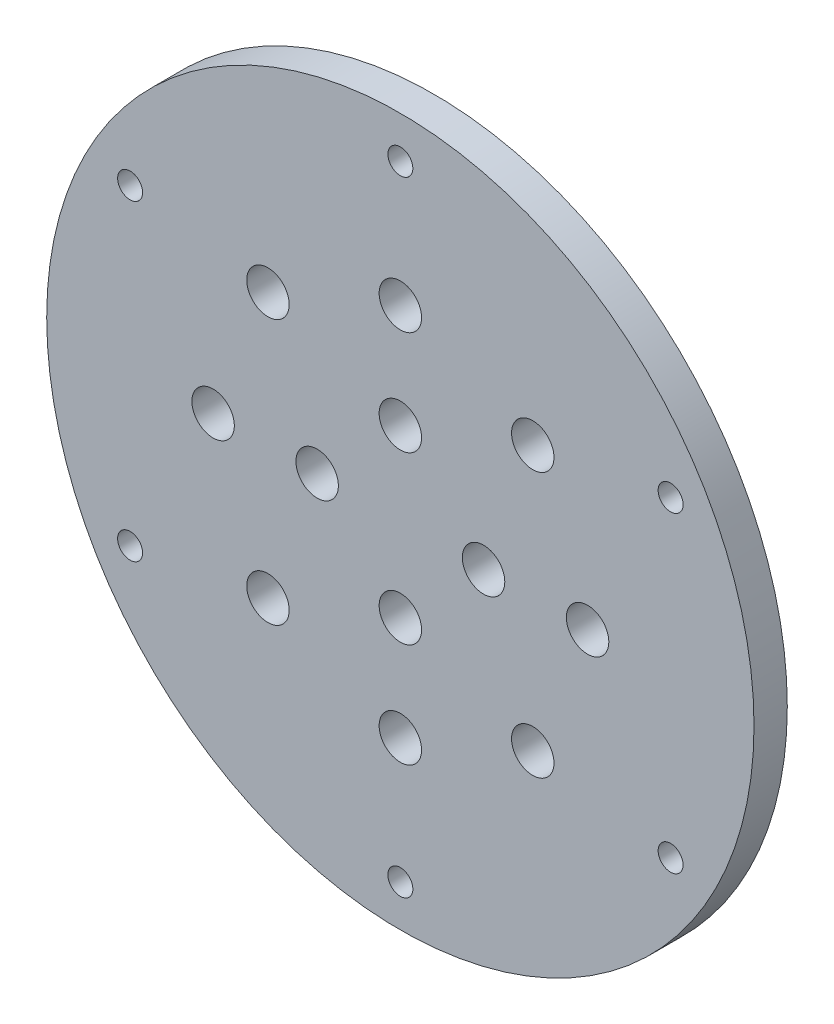
ISO-10303-21;
HEADER;
FILE_DESCRIPTION(('STEP AP214'),'2;1');
FILE_NAME('part.step','',(''),(''),'','','');
FILE_SCHEMA(('AUTOMOTIVE_DESIGN { 1 0 10303 214 1 1 1 1 }'));
ENDSEC;
DATA;
#1=APPLICATION_CONTEXT('core data for automotive mechanical design processes');
#2=APPLICATION_PROTOCOL_DEFINITION('international standard','automotive_design',2000,#1);
#3=PRODUCT_CONTEXT('',#1,'mechanical');
#4=PRODUCT('Part','Part','',(#3));
#5=PRODUCT_RELATED_PRODUCT_CATEGORY('part','',(#4));
#6=PRODUCT_DEFINITION_FORMATION('','',#4);
#7=PRODUCT_DEFINITION_CONTEXT('part definition',#1,'design');
#8=PRODUCT_DEFINITION('design','',#6,#7);
#9=PRODUCT_DEFINITION_SHAPE('','',#8);
#10=(LENGTH_UNIT() NAMED_UNIT(*) SI_UNIT(.MILLI.,.METRE.));
#11=(NAMED_UNIT(*) PLANE_ANGLE_UNIT() SI_UNIT($,.RADIAN.));
#12=(NAMED_UNIT(*) SI_UNIT($,.STERADIAN.) SOLID_ANGLE_UNIT());
#13=UNCERTAINTY_MEASURE_WITH_UNIT(LENGTH_MEASURE(1.E-05),#10,'distance_accuracy_value','');
#14=(GEOMETRIC_REPRESENTATION_CONTEXT(3) GLOBAL_UNCERTAINTY_ASSIGNED_CONTEXT((#13)) GLOBAL_UNIT_ASSIGNED_CONTEXT((#10,
#11,#12)) REPRESENTATION_CONTEXT('',''));
#15=CARTESIAN_POINT('',(0.,0.,0.));
#16=DIRECTION('',(0.,0.,1.));
#17=DIRECTION('',(1.,0.,0.));
#18=AXIS2_PLACEMENT_3D('',#15,#16,#17);
#19=CARTESIAN_POINT('',(0.,0.,8.));
#20=DIRECTION('',(0.,0.,1.));
#21=DIRECTION('',(1.,0.,0.));
#22=AXIS2_PLACEMENT_3D('',#19,#20,#21);
#23=PLANE('',#22);
#24=CARTESIAN_POINT('',(0.,45.,8.));
#25=DIRECTION('',(0.,0.,1.));
#26=DIRECTION('',(1.,0.,0.));
#27=AXIS2_PLACEMENT_3D('',#24,#25,#26);
#28=CIRCLE('',#27,5.1);
#29=CARTESIAN_POINT('',(5.1,45.,8.));
#30=VERTEX_POINT('',#29);
#31=EDGE_CURVE('E115',#30,#30,#28,.T.);
#32=ORIENTED_EDGE('',*,*,#31,.F.);
#33=EDGE_LOOP('',(#32));
#34=FACE_BOUND('',#33,.T.);
#35=CARTESIAN_POINT('',(-20.,2.09488880330588E-13,8.));
#36=DIRECTION('',(0.,0.,1.));
#37=DIRECTION('',(1.,0.,0.));
#38=AXIS2_PLACEMENT_3D('',#35,#36,#37);
#39=CIRCLE('',#38,5.1);
#40=CARTESIAN_POINT('',(-14.9,2.09488880330588E-13,8.));
#41=VERTEX_POINT('',#40);
#42=EDGE_CURVE('E140',#41,#41,#39,.T.);
#43=ORIENTED_EDGE('',*,*,#42,.F.);
#44=EDGE_LOOP('',(#43));
#45=FACE_BOUND('',#44,.T.);
#46=CARTESIAN_POINT('',(-1.39659253553725E-13,-20.,8.));
#47=DIRECTION('',(0.,0.,1.));
#48=DIRECTION('',(1.,0.,0.));
#49=AXIS2_PLACEMENT_3D('',#46,#47,#48);
#50=CIRCLE('',#49,5.1);
#51=CARTESIAN_POINT('',(5.09999999999986,-20.,8.));
#52=VERTEX_POINT('',#51);
#53=EDGE_CURVE('E146',#52,#52,#50,.T.);
#54=ORIENTED_EDGE('',*,*,#53,.F.);
#55=EDGE_LOOP('',(#54));
#56=FACE_BOUND('',#55,.T.);
#57=CARTESIAN_POINT('',(20.,0.,8.));
#58=DIRECTION('',(0.,0.,1.));
#59=DIRECTION('',(1.,0.,0.));
#60=AXIS2_PLACEMENT_3D('',#57,#58,#59);
#61=CIRCLE('',#60,5.1);
#62=CARTESIAN_POINT('',(25.1,0.,8.));
#63=VERTEX_POINT('',#62);
#64=EDGE_CURVE('E152',#63,#63,#61,.T.);
#65=ORIENTED_EDGE('',*,*,#64,.F.);
#66=EDGE_LOOP('',(#65));
#67=FACE_BOUND('',#66,.T.);
#68=CARTESIAN_POINT('',(31.8198051533946,31.8198051533946,8.));
#69=DIRECTION('',(0.,0.,1.));
#70=DIRECTION('',(1.,0.,0.));
#71=AXIS2_PLACEMENT_3D('',#68,#69,#70);
#72=CIRCLE('',#71,5.1);
#73=CARTESIAN_POINT('',(36.9198051533946,31.8198051533946,8.));
#74=VERTEX_POINT('',#73);
#75=EDGE_CURVE('E109',#74,#74,#72,.T.);
#76=ORIENTED_EDGE('',*,*,#75,.F.);
#77=EDGE_LOOP('',(#76));
#78=FACE_BOUND('',#77,.T.);
#79=CARTESIAN_POINT('',(45.,0.,8.));
#80=DIRECTION('',(0.,0.,1.));
#81=DIRECTION('',(1.,0.,0.));
#82=AXIS2_PLACEMENT_3D('',#79,#80,#81);
#83=CIRCLE('',#82,5.1);
#84=CARTESIAN_POINT('',(50.1,0.,8.));
#85=VERTEX_POINT('',#84);
#86=EDGE_CURVE('E103',#85,#85,#83,.T.);
#87=ORIENTED_EDGE('',*,*,#86,.F.);
#88=EDGE_LOOP('',(#87));
#89=FACE_BOUND('',#88,.T.);
#90=CARTESIAN_POINT('',(31.8198051533946,-31.8198051533946,8.));
#91=DIRECTION('',(0.,0.,1.));
#92=DIRECTION('',(1.,0.,0.));
#93=AXIS2_PLACEMENT_3D('',#90,#91,#92);
#94=CIRCLE('',#93,5.1);
#95=CARTESIAN_POINT('',(36.9198051533946,-31.8198051533946,8.));
#96=VERTEX_POINT('',#95);
#97=EDGE_CURVE('E97',#96,#96,#94,.T.);
#98=ORIENTED_EDGE('',*,*,#97,.F.);
#99=EDGE_LOOP('',(#98));
#100=FACE_BOUND('',#99,.T.);
#101=CARTESIAN_POINT('',(0.,-45.,8.));
#102=DIRECTION('',(0.,0.,1.));
#103=DIRECTION('',(1.,0.,0.));
#104=AXIS2_PLACEMENT_3D('',#101,#102,#103);
#105=CIRCLE('',#104,5.1);
#106=CARTESIAN_POINT('',(5.1,-45.,8.));
#107=VERTEX_POINT('',#106);
#108=EDGE_CURVE('E90',#107,#107,#105,.T.);
#109=ORIENTED_EDGE('',*,*,#108,.F.);
#110=EDGE_LOOP('',(#109));
#111=FACE_BOUND('',#110,.T.);
#112=CARTESIAN_POINT('',(-31.8198051533946,-31.8198051533946,8.));
#113=DIRECTION('',(0.,0.,1.));
#114=DIRECTION('',(1.,0.,0.));
#115=AXIS2_PLACEMENT_3D('',#112,#113,#114);
#116=CIRCLE('',#115,5.1);
#117=CARTESIAN_POINT('',(-26.7198051533946,-31.8198051533946,8.));
#118=VERTEX_POINT('',#117);
#119=EDGE_CURVE('E135',#118,#118,#116,.T.);
#120=ORIENTED_EDGE('',*,*,#119,.F.);
#121=EDGE_LOOP('',(#120));
#122=FACE_BOUND('',#121,.T.);
#123=CARTESIAN_POINT('',(-45.,0.,8.));
#124=DIRECTION('',(0.,0.,1.));
#125=DIRECTION('',(1.,0.,0.));
#126=AXIS2_PLACEMENT_3D('',#123,#124,#125);
#127=CIRCLE('',#126,5.1);
#128=CARTESIAN_POINT('',(-39.9,0.,8.));
#129=VERTEX_POINT('',#128);
#130=EDGE_CURVE('E129',#129,#129,#127,.T.);
#131=ORIENTED_EDGE('',*,*,#130,.F.);
#132=EDGE_LOOP('',(#131));
#133=FACE_BOUND('',#132,.T.);
#134=CARTESIAN_POINT('',(-31.8198051533946,31.8198051533946,8.));
#135=DIRECTION('',(0.,0.,1.));
#136=DIRECTION('',(1.,0.,0.));
#137=AXIS2_PLACEMENT_3D('',#134,#135,#136);
#138=CIRCLE('',#137,5.1);
#139=CARTESIAN_POINT('',(-26.7198051533946,31.8198051533946,8.));
#140=VERTEX_POINT('',#139);
#141=EDGE_CURVE('E123',#140,#140,#138,.T.);
#142=ORIENTED_EDGE('',*,*,#141,.F.);
#143=EDGE_LOOP('',(#142));
#144=FACE_BOUND('',#143,.T.);
#145=CARTESIAN_POINT('',(0.,20.,8.));
#146=DIRECTION('',(0.,0.,1.));
#147=DIRECTION('',(1.,0.,0.));
#148=AXIS2_PLACEMENT_3D('',#145,#146,#147);
#149=CIRCLE('',#148,5.1);
#150=CARTESIAN_POINT('',(5.1,20.,8.));
#151=VERTEX_POINT('',#150);
#152=EDGE_CURVE('E116',#151,#151,#149,.T.);
#153=ORIENTED_EDGE('',*,*,#152,.F.);
#154=EDGE_LOOP('',(#153));
#155=FACE_BOUND('',#154,.T.);
#156=CARTESIAN_POINT('',(3.95393406087404E-12,-75.,8.));
#157=DIRECTION('',(0.,0.,1.));
#158=DIRECTION('',(1.,0.,0.));
#159=AXIS2_PLACEMENT_3D('',#156,#157,#158);
#160=CIRCLE('',#159,3.);
#161=CARTESIAN_POINT('',(3.00000000000395,-75.,8.));
#162=VERTEX_POINT('',#161);
#163=EDGE_CURVE('E75',#162,#162,#160,.T.);
#164=ORIENTED_EDGE('',*,*,#163,.F.);
#165=EDGE_LOOP('',(#164));
#166=FACE_BOUND('',#165,.T.);
#167=CARTESIAN_POINT('',(64.9519052838339,37.5000000000017,8.));
#168=DIRECTION('',(0.,0.,1.));
#169=DIRECTION('',(1.,0.,0.));
#170=AXIS2_PLACEMENT_3D('',#167,#168,#169);
#171=CIRCLE('',#170,3.00000000000001);
#172=CARTESIAN_POINT('',(67.9519052838339,37.5000000000017,8.));
#173=VERTEX_POINT('',#172);
#174=EDGE_CURVE('E63',#173,#173,#171,.T.);
#175=ORIENTED_EDGE('',*,*,#174,.F.);
#176=EDGE_LOOP('',(#175));
#177=FACE_BOUND('',#176,.T.);
#178=CARTESIAN_POINT('',(0.,75.,8.));
#179=DIRECTION('',(0.,0.,1.));
#180=DIRECTION('',(1.,0.,0.));
#181=AXIS2_PLACEMENT_3D('',#178,#179,#180);
#182=CIRCLE('',#181,3.);
#183=CARTESIAN_POINT('',(3.,75.,8.));
#184=VERTEX_POINT('',#183);
#185=EDGE_CURVE('E52',#184,#184,#182,.T.);
#186=ORIENTED_EDGE('',*,*,#185,.F.);
#187=EDGE_LOOP('',(#186));
#188=FACE_BOUND('',#187,.T.);
#189=CARTESIAN_POINT('',(0.,0.,8.));
#190=DIRECTION('',(0.,0.,1.));
#191=DIRECTION('',(1.,0.,0.));
#192=AXIS2_PLACEMENT_3D('',#189,#190,#191);
#193=CIRCLE('',#192,85.);
#194=CARTESIAN_POINT('',(85.,0.,8.));
#195=VERTEX_POINT('',#194);
#196=EDGE_CURVE('E10',#195,#195,#193,.T.);
#197=ORIENTED_EDGE('',*,*,#196,.T.);
#198=EDGE_LOOP('',(#197));
#199=FACE_BOUND('',#198,.T.);
#200=CARTESIAN_POINT('',(-64.9519052838299,-37.5000000000017,8.));
#201=DIRECTION('',(0.,0.,1.));
#202=DIRECTION('',(1.,0.,0.));
#203=AXIS2_PLACEMENT_3D('',#200,#201,#202);
#204=CIRCLE('',#203,3.);
#205=CARTESIAN_POINT('',(-61.9519052838299,-37.5000000000017,8.));
#206=VERTEX_POINT('',#205);
#207=EDGE_CURVE('E57',#206,#206,#204,.T.);
#208=ORIENTED_EDGE('',*,*,#207,.F.);
#209=EDGE_LOOP('',(#208));
#210=FACE_BOUND('',#209,.T.);
#211=CARTESIAN_POINT('',(64.9519052838359,-37.4999999999983,8.));
#212=DIRECTION('',(0.,0.,1.));
#213=DIRECTION('',(1.,0.,0.));
#214=AXIS2_PLACEMENT_3D('',#211,#212,#213);
#215=CIRCLE('',#214,3.00000000000001);
#216=CARTESIAN_POINT('',(67.9519052838359,-37.4999999999983,8.));
#217=VERTEX_POINT('',#216);
#218=EDGE_CURVE('E69',#217,#217,#215,.T.);
#219=ORIENTED_EDGE('',*,*,#218,.F.);
#220=EDGE_LOOP('',(#219));
#221=FACE_BOUND('',#220,.T.);
#222=CARTESIAN_POINT('',(-64.9519052838319,37.4999999999982,8.));
#223=DIRECTION('',(0.,0.,1.));
#224=DIRECTION('',(1.,0.,0.));
#225=AXIS2_PLACEMENT_3D('',#222,#223,#224);
#226=CIRCLE('',#225,3.);
#227=CARTESIAN_POINT('',(-61.9519052838319,37.4999999999982,8.));
#228=VERTEX_POINT('',#227);
#229=EDGE_CURVE('E81',#228,#228,#226,.T.);
#230=ORIENTED_EDGE('',*,*,#229,.F.);
#231=EDGE_LOOP('',(#230));
#232=FACE_BOUND('',#231,.T.);
#233=ADVANCED_FACE('F41',(#34,#45,#56,#67,#78,#89,#100,#111,#122,#133,#144,#155,#166,#177,#188,
#199,#210,#221,#232),#23,.T.);
#234=CARTESIAN_POINT('',(0.,0.,0.));
#235=DIRECTION('',(0.,0.,1.));
#236=DIRECTION('',(1.,0.,0.));
#237=AXIS2_PLACEMENT_3D('',#234,#235,#236);
#238=PLANE('',#237);
#239=CARTESIAN_POINT('',(0.,45.,0.));
#240=DIRECTION('',(0.,0.,1.));
#241=DIRECTION('',(1.,0.,0.));
#242=AXIS2_PLACEMENT_3D('',#239,#240,#241);
#243=CIRCLE('',#242,5.1);
#244=CARTESIAN_POINT('',(5.1,45.,0.));
#245=VERTEX_POINT('',#244);
#246=EDGE_CURVE('E87',#245,#245,#243,.T.);
#247=ORIENTED_EDGE('',*,*,#246,.T.);
#248=EDGE_LOOP('',(#247));
#249=FACE_BOUND('',#248,.T.);
#250=CARTESIAN_POINT('',(-20.,2.09488880330588E-13,0.));
#251=DIRECTION('',(0.,0.,1.));
#252=DIRECTION('',(1.,0.,0.));
#253=AXIS2_PLACEMENT_3D('',#250,#251,#252);
#254=CIRCLE('',#253,5.1);
#255=CARTESIAN_POINT('',(-14.9,2.09488880330588E-13,0.));
#256=VERTEX_POINT('',#255);
#257=EDGE_CURVE('E143',#256,#256,#254,.T.);
#258=ORIENTED_EDGE('',*,*,#257,.T.);
#259=EDGE_LOOP('',(#258));
#260=FACE_BOUND('',#259,.T.);
#261=CARTESIAN_POINT('',(-1.39659253553725E-13,-20.,0.));
#262=DIRECTION('',(0.,0.,1.));
#263=DIRECTION('',(1.,0.,0.));
#264=AXIS2_PLACEMENT_3D('',#261,#262,#263);
#265=CIRCLE('',#264,5.1);
#266=CARTESIAN_POINT('',(5.09999999999986,-20.,0.));
#267=VERTEX_POINT('',#266);
#268=EDGE_CURVE('E149',#267,#267,#265,.T.);
#269=ORIENTED_EDGE('',*,*,#268,.T.);
#270=EDGE_LOOP('',(#269));
#271=FACE_BOUND('',#270,.T.);
#272=CARTESIAN_POINT('',(20.,0.,0.));
#273=DIRECTION('',(0.,0.,1.));
#274=DIRECTION('',(1.,0.,0.));
#275=AXIS2_PLACEMENT_3D('',#272,#273,#274);
#276=CIRCLE('',#275,5.1);
#277=CARTESIAN_POINT('',(25.1,0.,0.));
#278=VERTEX_POINT('',#277);
#279=EDGE_CURVE('E120',#278,#278,#276,.T.);
#280=ORIENTED_EDGE('',*,*,#279,.T.);
#281=EDGE_LOOP('',(#280));
#282=FACE_BOUND('',#281,.T.);
#283=CARTESIAN_POINT('',(31.8198051533946,31.8198051533946,0.));
#284=DIRECTION('',(0.,0.,1.));
#285=DIRECTION('',(1.,0.,0.));
#286=AXIS2_PLACEMENT_3D('',#283,#284,#285);
#287=CIRCLE('',#286,5.1);
#288=CARTESIAN_POINT('',(36.9198051533946,31.8198051533946,0.));
#289=VERTEX_POINT('',#288);
#290=EDGE_CURVE('E112',#289,#289,#287,.T.);
#291=ORIENTED_EDGE('',*,*,#290,.T.);
#292=EDGE_LOOP('',(#291));
#293=FACE_BOUND('',#292,.T.);
#294=CARTESIAN_POINT('',(45.,0.,0.));
#295=DIRECTION('',(0.,0.,1.));
#296=DIRECTION('',(1.,0.,0.));
#297=AXIS2_PLACEMENT_3D('',#294,#295,#296);
#298=CIRCLE('',#297,5.1);
#299=CARTESIAN_POINT('',(50.1,0.,0.));
#300=VERTEX_POINT('',#299);
#301=EDGE_CURVE('E106',#300,#300,#298,.T.);
#302=ORIENTED_EDGE('',*,*,#301,.T.);
#303=EDGE_LOOP('',(#302));
#304=FACE_BOUND('',#303,.T.);
#305=CARTESIAN_POINT('',(31.8198051533946,-31.8198051533946,0.));
#306=DIRECTION('',(0.,0.,1.));
#307=DIRECTION('',(1.,0.,0.));
#308=AXIS2_PLACEMENT_3D('',#305,#306,#307);
#309=CIRCLE('',#308,5.1);
#310=CARTESIAN_POINT('',(36.9198051533946,-31.8198051533946,0.));
#311=VERTEX_POINT('',#310);
#312=EDGE_CURVE('E100',#311,#311,#309,.T.);
#313=ORIENTED_EDGE('',*,*,#312,.T.);
#314=EDGE_LOOP('',(#313));
#315=FACE_BOUND('',#314,.T.);
#316=CARTESIAN_POINT('',(0.,-45.,0.));
#317=DIRECTION('',(0.,0.,1.));
#318=DIRECTION('',(1.,0.,0.));
#319=AXIS2_PLACEMENT_3D('',#316,#317,#318);
#320=CIRCLE('',#319,5.1);
#321=CARTESIAN_POINT('',(5.1,-45.,0.));
#322=VERTEX_POINT('',#321);
#323=EDGE_CURVE('E93',#322,#322,#320,.T.);
#324=ORIENTED_EDGE('',*,*,#323,.T.);
#325=EDGE_LOOP('',(#324));
#326=FACE_BOUND('',#325,.T.);
#327=CARTESIAN_POINT('',(-31.8198051533946,-31.8198051533946,0.));
#328=DIRECTION('',(0.,0.,1.));
#329=DIRECTION('',(1.,0.,0.));
#330=AXIS2_PLACEMENT_3D('',#327,#328,#329);
#331=CIRCLE('',#330,5.1);
#332=CARTESIAN_POINT('',(-26.7198051533946,-31.8198051533946,0.));
#333=VERTEX_POINT('',#332);
#334=EDGE_CURVE('E94',#333,#333,#331,.T.);
#335=ORIENTED_EDGE('',*,*,#334,.T.);
#336=EDGE_LOOP('',(#335));
#337=FACE_BOUND('',#336,.T.);
#338=CARTESIAN_POINT('',(-45.,0.,0.));
#339=DIRECTION('',(0.,0.,1.));
#340=DIRECTION('',(1.,0.,0.));
#341=AXIS2_PLACEMENT_3D('',#338,#339,#340);
#342=CIRCLE('',#341,5.1);
#343=CARTESIAN_POINT('',(-39.9,0.,0.));
#344=VERTEX_POINT('',#343);
#345=EDGE_CURVE('E132',#344,#344,#342,.T.);
#346=ORIENTED_EDGE('',*,*,#345,.T.);
#347=EDGE_LOOP('',(#346));
#348=FACE_BOUND('',#347,.T.);
#349=CARTESIAN_POINT('',(-31.8198051533946,31.8198051533946,0.));
#350=DIRECTION('',(0.,0.,1.));
#351=DIRECTION('',(1.,0.,0.));
#352=AXIS2_PLACEMENT_3D('',#349,#350,#351);
#353=CIRCLE('',#352,5.1);
#354=CARTESIAN_POINT('',(-26.7198051533946,31.8198051533946,0.));
#355=VERTEX_POINT('',#354);
#356=EDGE_CURVE('E126',#355,#355,#353,.T.);
#357=ORIENTED_EDGE('',*,*,#356,.T.);
#358=EDGE_LOOP('',(#357));
#359=FACE_BOUND('',#358,.T.);
#360=CARTESIAN_POINT('',(0.,20.,0.));
#361=DIRECTION('',(0.,0.,1.));
#362=DIRECTION('',(1.,0.,0.));
#363=AXIS2_PLACEMENT_3D('',#360,#361,#362);
#364=CIRCLE('',#363,5.1);
#365=CARTESIAN_POINT('',(5.1,20.,0.));
#366=VERTEX_POINT('',#365);
#367=EDGE_CURVE('E119',#366,#366,#364,.T.);
#368=ORIENTED_EDGE('',*,*,#367,.T.);
#369=EDGE_LOOP('',(#368));
#370=FACE_BOUND('',#369,.T.);
#371=CARTESIAN_POINT('',(0.,0.,0.));
#372=DIRECTION('',(0.,0.,1.));
#373=DIRECTION('',(1.,0.,0.));
#374=AXIS2_PLACEMENT_3D('',#371,#372,#373);
#375=CIRCLE('',#374,85.);
#376=CARTESIAN_POINT('',(85.,0.,0.));
#377=VERTEX_POINT('',#376);
#378=EDGE_CURVE('E45',#377,#377,#375,.T.);
#379=ORIENTED_EDGE('',*,*,#378,.F.);
#380=EDGE_LOOP('',(#379));
#381=FACE_BOUND('',#380,.T.);
#382=CARTESIAN_POINT('',(0.,75.,0.));
#383=DIRECTION('',(0.,0.,1.));
#384=DIRECTION('',(1.,0.,0.));
#385=AXIS2_PLACEMENT_3D('',#382,#383,#384);
#386=CIRCLE('',#385,3.);
#387=CARTESIAN_POINT('',(3.,75.,0.));
#388=VERTEX_POINT('',#387);
#389=EDGE_CURVE('E54',#388,#388,#386,.T.);
#390=ORIENTED_EDGE('',*,*,#389,.T.);
#391=EDGE_LOOP('',(#390));
#392=FACE_BOUND('',#391,.T.);
#393=CARTESIAN_POINT('',(-64.9519052838299,-37.5000000000017,0.));
#394=DIRECTION('',(0.,0.,1.));
#395=DIRECTION('',(1.,0.,0.));
#396=AXIS2_PLACEMENT_3D('',#393,#394,#395);
#397=CIRCLE('',#396,3.);
#398=CARTESIAN_POINT('',(-61.9519052838299,-37.5000000000017,0.));
#399=VERTEX_POINT('',#398);
#400=EDGE_CURVE('E60',#399,#399,#397,.T.);
#401=ORIENTED_EDGE('',*,*,#400,.T.);
#402=EDGE_LOOP('',(#401));
#403=FACE_BOUND('',#402,.T.);
#404=CARTESIAN_POINT('',(64.9519052838339,37.5000000000017,0.));
#405=DIRECTION('',(0.,0.,1.));
#406=DIRECTION('',(1.,0.,0.));
#407=AXIS2_PLACEMENT_3D('',#404,#405,#406);
#408=CIRCLE('',#407,3.00000000000001);
#409=CARTESIAN_POINT('',(67.9519052838339,37.5000000000017,0.));
#410=VERTEX_POINT('',#409);
#411=EDGE_CURVE('E66',#410,#410,#408,.T.);
#412=ORIENTED_EDGE('',*,*,#411,.T.);
#413=EDGE_LOOP('',(#412));
#414=FACE_BOUND('',#413,.T.);
#415=CARTESIAN_POINT('',(64.9519052838359,-37.4999999999983,0.));
#416=DIRECTION('',(0.,0.,1.));
#417=DIRECTION('',(1.,0.,0.));
#418=AXIS2_PLACEMENT_3D('',#415,#416,#417);
#419=CIRCLE('',#418,3.00000000000001);
#420=CARTESIAN_POINT('',(67.9519052838359,-37.4999999999983,0.));
#421=VERTEX_POINT('',#420);
#422=EDGE_CURVE('E72',#421,#421,#419,.T.);
#423=ORIENTED_EDGE('',*,*,#422,.T.);
#424=EDGE_LOOP('',(#423));
#425=FACE_BOUND('',#424,.T.);
#426=CARTESIAN_POINT('',(3.95393406087404E-12,-75.,0.));
#427=DIRECTION('',(0.,0.,1.));
#428=DIRECTION('',(1.,0.,0.));
#429=AXIS2_PLACEMENT_3D('',#426,#427,#428);
#430=CIRCLE('',#429,3.);
#431=CARTESIAN_POINT('',(3.00000000000395,-75.,0.));
#432=VERTEX_POINT('',#431);
#433=EDGE_CURVE('E78',#432,#432,#430,.T.);
#434=ORIENTED_EDGE('',*,*,#433,.T.);
#435=EDGE_LOOP('',(#434));
#436=FACE_BOUND('',#435,.T.);
#437=CARTESIAN_POINT('',(-64.9519052838319,37.4999999999982,0.));
#438=DIRECTION('',(0.,0.,1.));
#439=DIRECTION('',(1.,0.,0.));
#440=AXIS2_PLACEMENT_3D('',#437,#438,#439);
#441=CIRCLE('',#440,3.);
#442=CARTESIAN_POINT('',(-61.9519052838319,37.4999999999982,0.));
#443=VERTEX_POINT('',#442);
#444=EDGE_CURVE('E84',#443,#443,#441,.T.);
#445=ORIENTED_EDGE('',*,*,#444,.T.);
#446=EDGE_LOOP('',(#445));
#447=FACE_BOUND('',#446,.T.);
#448=ADVANCED_FACE('F162',(#249,#260,#271,#282,#293,#304,#315,#326,#337,#348,#359,#370,#381,
#392,#403,#414,#425,#436,#447),#238,.F.);
#449=CARTESIAN_POINT('',(0.,0.,8.));
#450=DIRECTION('',(0.,0.,-1.));
#451=DIRECTION('',(-1.,0.,0.));
#452=AXIS2_PLACEMENT_3D('',#449,#450,#451);
#453=CYLINDRICAL_SURFACE('',#452,85.);
#454=ORIENTED_EDGE('',*,*,#196,.F.);
#455=EDGE_LOOP('',(#454));
#456=FACE_BOUND('',#455,.T.);
#457=ORIENTED_EDGE('',*,*,#378,.T.);
#458=EDGE_LOOP('',(#457));
#459=FACE_BOUND('',#458,.T.);
#460=ADVANCED_FACE('F43',(#456,#459),#453,.T.);
#461=CARTESIAN_POINT('',(0.,75.,8.));
#462=DIRECTION('',(0.,0.,-1.));
#463=DIRECTION('',(-1.,0.,0.));
#464=AXIS2_PLACEMENT_3D('',#461,#462,#463);
#465=CYLINDRICAL_SURFACE('',#464,3.);
#466=ORIENTED_EDGE('',*,*,#185,.T.);
#467=EDGE_LOOP('',(#466));
#468=FACE_BOUND('',#467,.T.);
#469=ORIENTED_EDGE('',*,*,#389,.F.);
#470=EDGE_LOOP('',(#469));
#471=FACE_BOUND('',#470,.T.);
#472=ADVANCED_FACE('F222',(#468,#471),#465,.F.);
#473=CARTESIAN_POINT('',(-64.9519052838299,-37.5000000000017,8.));
#474=DIRECTION('',(0.,0.,-1.));
#475=DIRECTION('',(-1.,0.,0.));
#476=AXIS2_PLACEMENT_3D('',#473,#474,#475);
#477=CYLINDRICAL_SURFACE('',#476,3.);
#478=ORIENTED_EDGE('',*,*,#207,.T.);
#479=EDGE_LOOP('',(#478));
#480=FACE_BOUND('',#479,.T.);
#481=ORIENTED_EDGE('',*,*,#400,.F.);
#482=EDGE_LOOP('',(#481));
#483=FACE_BOUND('',#482,.T.);
#484=ADVANCED_FACE('F227',(#480,#483),#477,.F.);
#485=CARTESIAN_POINT('',(64.9519052838339,37.5000000000017,8.));
#486=DIRECTION('',(0.,0.,-1.));
#487=DIRECTION('',(-1.,0.,0.));
#488=AXIS2_PLACEMENT_3D('',#485,#486,#487);
#489=CYLINDRICAL_SURFACE('',#488,3.00000000000001);
#490=ORIENTED_EDGE('',*,*,#174,.T.);
#491=EDGE_LOOP('',(#490));
#492=FACE_BOUND('',#491,.T.);
#493=ORIENTED_EDGE('',*,*,#411,.F.);
#494=EDGE_LOOP('',(#493));
#495=FACE_BOUND('',#494,.T.);
#496=ADVANCED_FACE('F231',(#492,#495),#489,.F.);
#497=CARTESIAN_POINT('',(64.9519052838359,-37.4999999999983,8.));
#498=DIRECTION('',(0.,0.,-1.));
#499=DIRECTION('',(-1.,0.,0.));
#500=AXIS2_PLACEMENT_3D('',#497,#498,#499);
#501=CYLINDRICAL_SURFACE('',#500,3.00000000000001);
#502=ORIENTED_EDGE('',*,*,#218,.T.);
#503=EDGE_LOOP('',(#502));
#504=FACE_BOUND('',#503,.T.);
#505=ORIENTED_EDGE('',*,*,#422,.F.);
#506=EDGE_LOOP('',(#505));
#507=FACE_BOUND('',#506,.T.);
#508=ADVANCED_FACE('F235',(#504,#507),#501,.F.);
#509=CARTESIAN_POINT('',(3.95393406087404E-12,-75.,8.));
#510=DIRECTION('',(0.,0.,-1.));
#511=DIRECTION('',(-1.,0.,0.));
#512=AXIS2_PLACEMENT_3D('',#509,#510,#511);
#513=CYLINDRICAL_SURFACE('',#512,3.);
#514=ORIENTED_EDGE('',*,*,#163,.T.);
#515=EDGE_LOOP('',(#514));
#516=FACE_BOUND('',#515,.T.);
#517=ORIENTED_EDGE('',*,*,#433,.F.);
#518=EDGE_LOOP('',(#517));
#519=FACE_BOUND('',#518,.T.);
#520=ADVANCED_FACE('F213',(#516,#519),#513,.F.);
#521=CARTESIAN_POINT('',(-64.9519052838319,37.4999999999982,8.));
#522=DIRECTION('',(0.,0.,-1.));
#523=DIRECTION('',(-1.,0.,0.));
#524=AXIS2_PLACEMENT_3D('',#521,#522,#523);
#525=CYLINDRICAL_SURFACE('',#524,3.);
#526=ORIENTED_EDGE('',*,*,#229,.T.);
#527=EDGE_LOOP('',(#526));
#528=FACE_BOUND('',#527,.T.);
#529=ORIENTED_EDGE('',*,*,#444,.F.);
#530=EDGE_LOOP('',(#529));
#531=FACE_BOUND('',#530,.T.);
#532=ADVANCED_FACE('F209',(#528,#531),#525,.F.);
#533=CARTESIAN_POINT('',(0.,20.,0.));
#534=DIRECTION('',(0.,0.,1.));
#535=DIRECTION('',(1.,0.,0.));
#536=AXIS2_PLACEMENT_3D('',#533,#534,#535);
#537=CYLINDRICAL_SURFACE('',#536,5.1);
#538=ORIENTED_EDGE('',*,*,#367,.F.);
#539=EDGE_LOOP('',(#538));
#540=FACE_BOUND('',#539,.T.);
#541=ORIENTED_EDGE('',*,*,#152,.T.);
#542=EDGE_LOOP('',(#541));
#543=FACE_BOUND('',#542,.T.);
#544=ADVANCED_FACE('F212',(#540,#543),#537,.F.);
#545=CARTESIAN_POINT('',(-31.8198051533946,31.8198051533946,0.));
#546=DIRECTION('',(0.,0.,1.));
#547=DIRECTION('',(1.,0.,0.));
#548=AXIS2_PLACEMENT_3D('',#545,#546,#547);
#549=CYLINDRICAL_SURFACE('',#548,5.1);
#550=ORIENTED_EDGE('',*,*,#356,.F.);
#551=EDGE_LOOP('',(#550));
#552=FACE_BOUND('',#551,.T.);
#553=ORIENTED_EDGE('',*,*,#141,.T.);
#554=EDGE_LOOP('',(#553));
#555=FACE_BOUND('',#554,.T.);
#556=ADVANCED_FACE('F262',(#552,#555),#549,.F.);
#557=CARTESIAN_POINT('',(-45.,0.,0.));
#558=DIRECTION('',(0.,0.,1.));
#559=DIRECTION('',(1.,0.,0.));
#560=AXIS2_PLACEMENT_3D('',#557,#558,#559);
#561=CYLINDRICAL_SURFACE('',#560,5.1);
#562=ORIENTED_EDGE('',*,*,#345,.F.);
#563=EDGE_LOOP('',(#562));
#564=FACE_BOUND('',#563,.T.);
#565=ORIENTED_EDGE('',*,*,#130,.T.);
#566=EDGE_LOOP('',(#565));
#567=FACE_BOUND('',#566,.T.);
#568=ADVANCED_FACE('F266',(#564,#567),#561,.F.);
#569=CARTESIAN_POINT('',(-31.8198051533946,-31.8198051533946,0.));
#570=DIRECTION('',(0.,0.,1.));
#571=DIRECTION('',(1.,0.,0.));
#572=AXIS2_PLACEMENT_3D('',#569,#570,#571);
#573=CYLINDRICAL_SURFACE('',#572,5.1);
#574=ORIENTED_EDGE('',*,*,#334,.F.);
#575=EDGE_LOOP('',(#574));
#576=FACE_BOUND('',#575,.T.);
#577=ORIENTED_EDGE('',*,*,#119,.T.);
#578=EDGE_LOOP('',(#577));
#579=FACE_BOUND('',#578,.T.);
#580=ADVANCED_FACE('F247',(#576,#579),#573,.F.);
#581=CARTESIAN_POINT('',(0.,-45.,0.));
#582=DIRECTION('',(0.,0.,1.));
#583=DIRECTION('',(1.,0.,0.));
#584=AXIS2_PLACEMENT_3D('',#581,#582,#583);
#585=CYLINDRICAL_SURFACE('',#584,5.1);
#586=ORIENTED_EDGE('',*,*,#323,.F.);
#587=EDGE_LOOP('',(#586));
#588=FACE_BOUND('',#587,.T.);
#589=ORIENTED_EDGE('',*,*,#108,.T.);
#590=EDGE_LOOP('',(#589));
#591=FACE_BOUND('',#590,.T.);
#592=ADVANCED_FACE('F243',(#588,#591),#585,.F.);
#593=CARTESIAN_POINT('',(31.8198051533946,-31.8198051533946,0.));
#594=DIRECTION('',(0.,0.,1.));
#595=DIRECTION('',(1.,0.,0.));
#596=AXIS2_PLACEMENT_3D('',#593,#594,#595);
#597=CYLINDRICAL_SURFACE('',#596,5.1);
#598=ORIENTED_EDGE('',*,*,#312,.F.);
#599=EDGE_LOOP('',(#598));
#600=FACE_BOUND('',#599,.T.);
#601=ORIENTED_EDGE('',*,*,#97,.T.);
#602=EDGE_LOOP('',(#601));
#603=FACE_BOUND('',#602,.T.);
#604=ADVANCED_FACE('F246',(#600,#603),#597,.F.);
#605=CARTESIAN_POINT('',(45.,0.,0.));
#606=DIRECTION('',(0.,0.,1.));
#607=DIRECTION('',(1.,0.,0.));
#608=AXIS2_PLACEMENT_3D('',#605,#606,#607);
#609=CYLINDRICAL_SURFACE('',#608,5.1);
#610=ORIENTED_EDGE('',*,*,#301,.F.);
#611=EDGE_LOOP('',(#610));
#612=FACE_BOUND('',#611,.T.);
#613=ORIENTED_EDGE('',*,*,#86,.T.);
#614=EDGE_LOOP('',(#613));
#615=FACE_BOUND('',#614,.T.);
#616=ADVANCED_FACE('F251',(#612,#615),#609,.F.);
#617=CARTESIAN_POINT('',(31.8198051533946,31.8198051533946,0.));
#618=DIRECTION('',(0.,0.,1.));
#619=DIRECTION('',(1.,0.,0.));
#620=AXIS2_PLACEMENT_3D('',#617,#618,#619);
#621=CYLINDRICAL_SURFACE('',#620,5.1);
#622=ORIENTED_EDGE('',*,*,#290,.F.);
#623=EDGE_LOOP('',(#622));
#624=FACE_BOUND('',#623,.T.);
#625=ORIENTED_EDGE('',*,*,#75,.T.);
#626=EDGE_LOOP('',(#625));
#627=FACE_BOUND('',#626,.T.);
#628=ADVANCED_FACE('F255',(#624,#627),#621,.F.);
#629=CARTESIAN_POINT('',(20.,0.,0.));
#630=DIRECTION('',(0.,0.,1.));
#631=DIRECTION('',(1.,0.,0.));
#632=AXIS2_PLACEMENT_3D('',#629,#630,#631);
#633=CYLINDRICAL_SURFACE('',#632,5.1);
#634=ORIENTED_EDGE('',*,*,#279,.F.);
#635=EDGE_LOOP('',(#634));
#636=FACE_BOUND('',#635,.T.);
#637=ORIENTED_EDGE('',*,*,#64,.T.);
#638=EDGE_LOOP('',(#637));
#639=FACE_BOUND('',#638,.T.);
#640=ADVANCED_FACE('F259',(#636,#639),#633,.F.);
#641=CARTESIAN_POINT('',(-1.39659253553725E-13,-20.,0.));
#642=DIRECTION('',(0.,0.,1.));
#643=DIRECTION('',(1.,0.,0.));
#644=AXIS2_PLACEMENT_3D('',#641,#642,#643);
#645=CYLINDRICAL_SURFACE('',#644,5.1);
#646=ORIENTED_EDGE('',*,*,#268,.F.);
#647=EDGE_LOOP('',(#646));
#648=FACE_BOUND('',#647,.T.);
#649=ORIENTED_EDGE('',*,*,#53,.T.);
#650=EDGE_LOOP('',(#649));
#651=FACE_BOUND('',#650,.T.);
#652=ADVANCED_FACE('F276',(#648,#651),#645,.F.);
#653=CARTESIAN_POINT('',(-20.,2.09488880330588E-13,0.));
#654=DIRECTION('',(0.,0.,1.));
#655=DIRECTION('',(1.,0.,0.));
#656=AXIS2_PLACEMENT_3D('',#653,#654,#655);
#657=CYLINDRICAL_SURFACE('',#656,5.1);
#658=ORIENTED_EDGE('',*,*,#257,.F.);
#659=EDGE_LOOP('',(#658));
#660=FACE_BOUND('',#659,.T.);
#661=ORIENTED_EDGE('',*,*,#42,.T.);
#662=EDGE_LOOP('',(#661));
#663=FACE_BOUND('',#662,.T.);
#664=ADVANCED_FACE('F168',(#660,#663),#657,.F.);
#665=CARTESIAN_POINT('',(0.,45.,0.));
#666=DIRECTION('',(0.,0.,1.));
#667=DIRECTION('',(1.,0.,0.));
#668=AXIS2_PLACEMENT_3D('',#665,#666,#667);
#669=CYLINDRICAL_SURFACE('',#668,5.1);
#670=ORIENTED_EDGE('',*,*,#246,.F.);
#671=EDGE_LOOP('',(#670));
#672=FACE_BOUND('',#671,.T.);
#673=ORIENTED_EDGE('',*,*,#31,.T.);
#674=EDGE_LOOP('',(#673));
#675=FACE_BOUND('',#674,.T.);
#676=ADVANCED_FACE('F165',(#672,#675),#669,.F.);
#677=CLOSED_SHELL('',(#233,#448,#460,#472,#484,#496,#508,#520,#532,#544,#556,#568,#580,#592,
#604,#616,#628,#640,#652,#664,#676));
#678=MANIFOLD_SOLID_BREP('B2',#677);
#679=ADVANCED_BREP_SHAPE_REPRESENTATION('',(#18,#678),#14);
#680=SHAPE_DEFINITION_REPRESENTATION(#9,#679);
ENDSEC;
END-ISO-10303-21;
